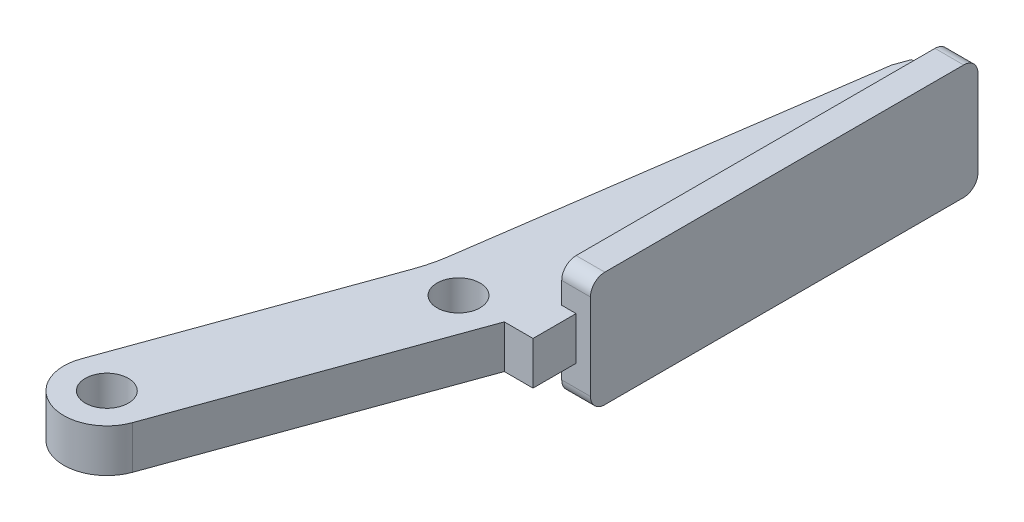
ISO-10303-21;
HEADER;
FILE_DESCRIPTION(('STEP AP214'),'2;1');
FILE_NAME('part.step','',(''),(''),'','','');
FILE_SCHEMA(('AUTOMOTIVE_DESIGN { 1 0 10303 214 1 1 1 1 }'));
ENDSEC;
DATA;
#1=APPLICATION_CONTEXT('core data for automotive mechanical design processes');
#2=APPLICATION_PROTOCOL_DEFINITION('international standard','automotive_design',2000,#1);
#3=PRODUCT_CONTEXT('',#1,'mechanical');
#4=PRODUCT('Part','Part','',(#3));
#5=PRODUCT_RELATED_PRODUCT_CATEGORY('part','',(#4));
#6=PRODUCT_DEFINITION_FORMATION('','',#4);
#7=PRODUCT_DEFINITION_CONTEXT('part definition',#1,'design');
#8=PRODUCT_DEFINITION('design','',#6,#7);
#9=PRODUCT_DEFINITION_SHAPE('','',#8);
#10=(LENGTH_UNIT() NAMED_UNIT(*) SI_UNIT(.MILLI.,.METRE.));
#11=(NAMED_UNIT(*) PLANE_ANGLE_UNIT() SI_UNIT($,.RADIAN.));
#12=(NAMED_UNIT(*) SI_UNIT($,.STERADIAN.) SOLID_ANGLE_UNIT());
#13=UNCERTAINTY_MEASURE_WITH_UNIT(LENGTH_MEASURE(1.E-05),#10,'distance_accuracy_value','');
#14=(GEOMETRIC_REPRESENTATION_CONTEXT(3) GLOBAL_UNCERTAINTY_ASSIGNED_CONTEXT((#13)) GLOBAL_UNIT_ASSIGNED_CONTEXT((#10,
#11,#12)) REPRESENTATION_CONTEXT('',''));
#15=CARTESIAN_POINT('',(0.,0.,0.));
#16=DIRECTION('',(0.,0.,1.));
#17=DIRECTION('',(1.,0.,0.));
#18=AXIS2_PLACEMENT_3D('',#15,#16,#17);
#19=CARTESIAN_POINT('',(11.6896098681674,1.5,0.));
#20=DIRECTION('',(1.,0.,0.));
#21=DIRECTION('',(0.,0.,-1.));
#22=AXIS2_PLACEMENT_3D('',#19,#20,#21);
#23=PLANE('',#22);
#24=DIRECTION('',(0.,0.,1.));
#25=VECTOR('',#24,1.);
#26=CARTESIAN_POINT('',(11.6896098681674,-1.5,0.));
#27=LINE('',#26,#25);
#28=CARTESIAN_POINT('',(11.6896098681674,-1.5,-21.));
#29=VERTEX_POINT('',#28);
#30=CARTESIAN_POINT('',(11.6896098681674,-1.5,-18.));
#31=VERTEX_POINT('',#30);
#32=EDGE_CURVE('E301',#29,#31,#27,.T.);
#33=ORIENTED_EDGE('',*,*,#32,.F.);
#34=DIRECTION('',(0.,1.,0.));
#35=VECTOR('',#34,1.);
#36=CARTESIAN_POINT('',(11.6896098681674,1.5,-21.));
#37=LINE('',#36,#35);
#38=CARTESIAN_POINT('',(11.6896098681674,1.5,-21.));
#39=VERTEX_POINT('',#38);
#40=EDGE_CURVE('E192',#29,#39,#37,.T.);
#41=ORIENTED_EDGE('',*,*,#40,.T.);
#42=DIRECTION('',(0.,0.,1.));
#43=VECTOR('',#42,1.);
#44=CARTESIAN_POINT('',(11.6896098681674,1.5,0.));
#45=LINE('',#44,#43);
#46=CARTESIAN_POINT('',(11.6896098681674,1.5,-18.));
#47=VERTEX_POINT('',#46);
#48=EDGE_CURVE('E258',#39,#47,#45,.T.);
#49=ORIENTED_EDGE('',*,*,#48,.T.);
#50=DIRECTION('',(0.,-1.,0.));
#51=VECTOR('',#50,1.);
#52=CARTESIAN_POINT('',(11.6896098681674,1.5,-18.));
#53=LINE('',#52,#51);
#54=EDGE_CURVE('E320',#47,#31,#53,.T.);
#55=ORIENTED_EDGE('',*,*,#54,.T.);
#56=EDGE_LOOP('',(#33,#41,#49,#55));
#57=FACE_BOUND('',#56,.T.);
#58=ADVANCED_FACE('F39',(#57),#23,.T.);
#59=CARTESIAN_POINT('',(0.,1.5,0.));
#60=DIRECTION('',(0.,1.,0.));
#61=DIRECTION('',(0.,0.,1.));
#62=AXIS2_PLACEMENT_3D('',#59,#60,#61);
#63=PLANE('',#62);
#64=CARTESIAN_POINT('',(6.5,1.5,-18.));
#65=DIRECTION('',(0.,1.,0.));
#66=DIRECTION('',(0.,0.,1.));
#67=AXIS2_PLACEMENT_3D('',#64,#65,#66);
#68=CIRCLE('',#67,1.5);
#69=CARTESIAN_POINT('',(6.5,1.5,-16.5));
#70=VERTEX_POINT('',#69);
#71=EDGE_CURVE('E230',#70,#70,#68,.T.);
#72=ORIENTED_EDGE('',*,*,#71,.F.);
#73=EDGE_LOOP('',(#72));
#74=FACE_BOUND('',#73,.T.);
#75=CARTESIAN_POINT('',(0.,1.5,0.));
#76=DIRECTION('',(0.,1.,0.));
#77=DIRECTION('',(0.,0.,1.));
#78=AXIS2_PLACEMENT_3D('',#75,#76,#77);
#79=CIRCLE('',#78,1.5);
#80=CARTESIAN_POINT('',(0.,1.5,1.5));
#81=VERTEX_POINT('',#80);
#82=EDGE_CURVE('E234',#81,#81,#79,.T.);
#83=ORIENTED_EDGE('',*,*,#82,.F.);
#84=EDGE_LOOP('',(#83));
#85=FACE_BOUND('',#84,.T.);
#86=DIRECTION('',(-1.,0.,0.));
#87=VECTOR('',#86,1.);
#88=CARTESIAN_POINT('',(0.,1.5,-21.));
#89=LINE('',#88,#87);
#90=CARTESIAN_POINT('',(10.6896098681674,1.5,-21.));
#91=VERTEX_POINT('',#90);
#92=EDGE_CURVE('E221',#39,#91,#89,.T.);
#93=ORIENTED_EDGE('',*,*,#92,.T.);
#94=DIRECTION('',(0.,0.,-1.));
#95=VECTOR('',#94,1.);
#96=CARTESIAN_POINT('',(10.6896098681674,1.5,0.));
#97=LINE('',#96,#95);
#98=CARTESIAN_POINT('',(10.6896098681674,1.5,-48.));
#99=VERTEX_POINT('',#98);
#100=EDGE_CURVE('E225',#91,#99,#97,.T.);
#101=ORIENTED_EDGE('',*,*,#100,.T.);
#102=DIRECTION('',(1.,0.,0.));
#103=VECTOR('',#102,1.);
#104=CARTESIAN_POINT('',(0.,1.5,-48.));
#105=LINE('',#104,#103);
#106=CARTESIAN_POINT('',(8.05072097927854,1.5,-48.));
#107=VERTEX_POINT('',#106);
#108=EDGE_CURVE('E261',#107,#99,#105,.T.);
#109=ORIENTED_EDGE('',*,*,#108,.F.);
#110=DIRECTION('',(0.339644463777556,0.,-0.940553899691696));
#111=VECTOR('',#110,1.);
#112=CARTESIAN_POINT('',(-8.211785399901,1.5,-2.96536694996424));
#113=LINE('',#112,#111);
#114=CARTESIAN_POINT('',(7.68960986816744,1.5,-47.));
#115=VERTEX_POINT('',#114);
#116=EDGE_CURVE('E265',#115,#107,#113,.T.);
#117=ORIENTED_EDGE('',*,*,#116,.F.);
#118=DIRECTION('',(0.142339631017767,0.,-0.989817876905507));
#119=VECTOR('',#118,1.);
#120=CARTESIAN_POINT('',(0.911969350312434,1.5,0.131144712428119));
#121=LINE('',#120,#119);
#122=CARTESIAN_POINT('',(3.80302990397067,1.5,-19.9730483275979));
#123=VERTEX_POINT('',#122);
#124=EDGE_CURVE('E269',#123,#115,#121,.T.);
#125=ORIENTED_EDGE('',*,*,#124,.F.);
#126=CARTESIAN_POINT('',(-6.09514886508441,1.5,-21.3964446377756));
#127=DIRECTION('',(0.,1.,0.));
#128=DIRECTION('',(0.,0.,1.));
#129=AXIS2_PLACEMENT_3D('',#126,#127,#128);
#130=CIRCLE('',#129,10.);
#131=CARTESIAN_POINT('',(3.31039013183255,1.5,-18.));
#132=VERTEX_POINT('',#131);
#133=EDGE_CURVE('E239',#132,#123,#130,.T.);
#134=ORIENTED_EDGE('',*,*,#133,.F.);
#135=DIRECTION('',(0.339644463777556,0.,-0.940553899691696));
#136=VECTOR('',#135,1.);
#137=CARTESIAN_POINT('',(-2.82166169907509,1.5,-1.01893339133267));
#138=LINE('',#137,#136);
#139=CARTESIAN_POINT('',(-2.82166169907509,1.5,-1.01893339133267));
#140=VERTEX_POINT('',#139);
#141=EDGE_CURVE('E243',#140,#132,#138,.T.);
#142=ORIENTED_EDGE('',*,*,#141,.F.);
#143=CARTESIAN_POINT('',(0.,1.5,0.));
#144=DIRECTION('',(0.,1.,0.));
#145=DIRECTION('',(0.,0.,1.));
#146=AXIS2_PLACEMENT_3D('',#143,#144,#145);
#147=CIRCLE('',#146,3.);
#148=CARTESIAN_POINT('',(2.82166169907509,1.5,1.01893339133267));
#149=VERTEX_POINT('',#148);
#150=EDGE_CURVE('E247',#140,#149,#147,.T.);
#151=ORIENTED_EDGE('',*,*,#150,.T.);
#152=DIRECTION('',(-0.339644463777557,0.,0.940553899691696));
#153=VECTOR('',#152,1.);
#154=CARTESIAN_POINT('',(2.82166169907509,1.5,1.01893339133267));
#155=LINE('',#154,#153);
#156=CARTESIAN_POINT('',(9.68960986816744,1.5,-18.));
#157=VERTEX_POINT('',#156);
#158=EDGE_CURVE('E250',#157,#149,#155,.T.);
#159=ORIENTED_EDGE('',*,*,#158,.F.);
#160=DIRECTION('',(-1.,0.,0.));
#161=VECTOR('',#160,1.);
#162=CARTESIAN_POINT('',(0.,1.5,-18.));
#163=LINE('',#162,#161);
#164=EDGE_CURVE('E254',#47,#157,#163,.T.);
#165=ORIENTED_EDGE('',*,*,#164,.F.);
#166=ORIENTED_EDGE('',*,*,#48,.F.);
#167=EDGE_LOOP('',(#93,#101,#109,#117,#125,#134,#142,#151,#159,#165,#166));
#168=FACE_BOUND('',#167,.T.);
#169=ADVANCED_FACE('F420',(#74,#85,#168),#63,.T.);
#170=CARTESIAN_POINT('',(0.,-1.5,0.));
#171=DIRECTION('',(0.,1.,0.));
#172=DIRECTION('',(0.,0.,1.));
#173=AXIS2_PLACEMENT_3D('',#170,#171,#172);
#174=PLANE('',#173);
#175=CARTESIAN_POINT('',(0.,-1.5,0.));
#176=DIRECTION('',(0.,1.,0.));
#177=DIRECTION('',(0.,0.,1.));
#178=AXIS2_PLACEMENT_3D('',#175,#176,#177);
#179=CIRCLE('',#178,1.5);
#180=CARTESIAN_POINT('',(0.,-1.5,1.5));
#181=VERTEX_POINT('',#180);
#182=EDGE_CURVE('E277',#181,#181,#179,.T.);
#183=ORIENTED_EDGE('',*,*,#182,.T.);
#184=EDGE_LOOP('',(#183));
#185=FACE_BOUND('',#184,.T.);
#186=CARTESIAN_POINT('',(6.5,-1.5,-18.));
#187=DIRECTION('',(0.,1.,0.));
#188=DIRECTION('',(0.,0.,1.));
#189=AXIS2_PLACEMENT_3D('',#186,#187,#188);
#190=CIRCLE('',#189,1.5);
#191=CARTESIAN_POINT('',(6.5,-1.5,-16.5));
#192=VERTEX_POINT('',#191);
#193=EDGE_CURVE('E229',#192,#192,#190,.T.);
#194=ORIENTED_EDGE('',*,*,#193,.T.);
#195=EDGE_LOOP('',(#194));
#196=FACE_BOUND('',#195,.T.);
#197=DIRECTION('',(0.,0.,-1.));
#198=VECTOR('',#197,1.);
#199=CARTESIAN_POINT('',(10.6896098681674,-1.5,0.));
#200=LINE('',#199,#198);
#201=CARTESIAN_POINT('',(10.6896098681674,-1.5,-21.));
#202=VERTEX_POINT('',#201);
#203=CARTESIAN_POINT('',(10.6896098681674,-1.5,-48.));
#204=VERTEX_POINT('',#203);
#205=EDGE_CURVE('E171',#202,#204,#200,.T.);
#206=ORIENTED_EDGE('',*,*,#205,.F.);
#207=DIRECTION('',(-1.,0.,0.));
#208=VECTOR('',#207,1.);
#209=CARTESIAN_POINT('',(0.,-1.5,-21.));
#210=LINE('',#209,#208);
#211=EDGE_CURVE('E174',#29,#202,#210,.T.);
#212=ORIENTED_EDGE('',*,*,#211,.F.);
#213=ORIENTED_EDGE('',*,*,#32,.T.);
#214=DIRECTION('',(-1.,0.,0.));
#215=VECTOR('',#214,1.);
#216=CARTESIAN_POINT('',(0.,-1.5,-18.));
#217=LINE('',#216,#215);
#218=CARTESIAN_POINT('',(9.68960986816744,-1.5,-18.));
#219=VERTEX_POINT('',#218);
#220=EDGE_CURVE('E297',#31,#219,#217,.T.);
#221=ORIENTED_EDGE('',*,*,#220,.T.);
#222=DIRECTION('',(-0.339644463777557,0.,0.940553899691696));
#223=VECTOR('',#222,1.);
#224=CARTESIAN_POINT('',(2.82166169907509,-1.5,1.01893339133267));
#225=LINE('',#224,#223);
#226=CARTESIAN_POINT('',(2.82166169907509,-1.5,1.01893339133267));
#227=VERTEX_POINT('',#226);
#228=EDGE_CURVE('E293',#219,#227,#225,.T.);
#229=ORIENTED_EDGE('',*,*,#228,.T.);
#230=CARTESIAN_POINT('',(0.,-1.5,0.));
#231=DIRECTION('',(0.,1.,0.));
#232=DIRECTION('',(0.,0.,1.));
#233=AXIS2_PLACEMENT_3D('',#230,#231,#232);
#234=CIRCLE('',#233,3.);
#235=CARTESIAN_POINT('',(-2.82166169907509,-1.5,-1.01893339133267));
#236=VERTEX_POINT('',#235);
#237=EDGE_CURVE('E289',#236,#227,#234,.T.);
#238=ORIENTED_EDGE('',*,*,#237,.F.);
#239=DIRECTION('',(0.339644463777556,0.,-0.940553899691696));
#240=VECTOR('',#239,1.);
#241=CARTESIAN_POINT('',(-2.82166169907509,-1.5,-1.01893339133267));
#242=LINE('',#241,#240);
#243=CARTESIAN_POINT('',(3.31039013183255,-1.5,-18.));
#244=VERTEX_POINT('',#243);
#245=EDGE_CURVE('E285',#236,#244,#242,.T.);
#246=ORIENTED_EDGE('',*,*,#245,.T.);
#247=CARTESIAN_POINT('',(-6.09514886508441,-1.5,-21.3964446377756));
#248=DIRECTION('',(0.,1.,0.));
#249=DIRECTION('',(0.,0.,1.));
#250=AXIS2_PLACEMENT_3D('',#247,#248,#249);
#251=CIRCLE('',#250,10.);
#252=CARTESIAN_POINT('',(3.80302990397067,-1.5,-19.9730483275979));
#253=VERTEX_POINT('',#252);
#254=EDGE_CURVE('E281',#244,#253,#251,.T.);
#255=ORIENTED_EDGE('',*,*,#254,.T.);
#256=DIRECTION('',(0.142339631017767,0.,-0.989817876905507));
#257=VECTOR('',#256,1.);
#258=CARTESIAN_POINT('',(0.911969350312434,-1.5,0.131144712428119));
#259=LINE('',#258,#257);
#260=CARTESIAN_POINT('',(7.68960986816744,-1.5,-47.));
#261=VERTEX_POINT('',#260);
#262=EDGE_CURVE('E235',#253,#261,#259,.T.);
#263=ORIENTED_EDGE('',*,*,#262,.T.);
#264=DIRECTION('',(0.339644463777556,0.,-0.940553899691696));
#265=VECTOR('',#264,1.);
#266=CARTESIAN_POINT('',(-8.211785399901,-1.5,-2.96536694996424));
#267=LINE('',#266,#265);
#268=CARTESIAN_POINT('',(8.05072097927854,-1.5,-48.));
#269=VERTEX_POINT('',#268);
#270=EDGE_CURVE('E306',#261,#269,#267,.T.);
#271=ORIENTED_EDGE('',*,*,#270,.T.);
#272=DIRECTION('',(1.,0.,0.));
#273=VECTOR('',#272,1.);
#274=CARTESIAN_POINT('',(0.,-1.5,-48.));
#275=LINE('',#274,#273);
#276=EDGE_CURVE('E178',#269,#204,#275,.T.);
#277=ORIENTED_EDGE('',*,*,#276,.T.);
#278=EDGE_LOOP('',(#206,#212,#213,#221,#229,#238,#246,#255,#263,#271,#277));
#279=FACE_BOUND('',#278,.T.);
#280=ADVANCED_FACE('F173',(#185,#196,#279),#174,.F.);
#281=CARTESIAN_POINT('',(-6.09514886508441,1.5,-21.3964446377756));
#282=DIRECTION('',(0.,-1.,0.));
#283=DIRECTION('',(0.,0.,-1.));
#284=AXIS2_PLACEMENT_3D('',#281,#282,#283);
#285=CYLINDRICAL_SURFACE('',#284,10.);
#286=ORIENTED_EDGE('',*,*,#254,.F.);
#287=DIRECTION('',(0.,-1.,0.));
#288=VECTOR('',#287,1.);
#289=CARTESIAN_POINT('',(3.31039013183255,1.5,-18.));
#290=LINE('',#289,#288);
#291=EDGE_CURVE('E194',#132,#244,#290,.T.);
#292=ORIENTED_EDGE('',*,*,#291,.F.);
#293=ORIENTED_EDGE('',*,*,#133,.T.);
#294=DIRECTION('',(0.,-1.,0.));
#295=VECTOR('',#294,1.);
#296=CARTESIAN_POINT('',(3.80302990397067,1.5,-19.9730483275979));
#297=LINE('',#296,#295);
#298=EDGE_CURVE('E273',#123,#253,#297,.T.);
#299=ORIENTED_EDGE('',*,*,#298,.T.);
#300=EDGE_LOOP('',(#286,#292,#293,#299));
#301=FACE_BOUND('',#300,.T.);
#302=ADVANCED_FACE('F478',(#301),#285,.F.);
#303=CARTESIAN_POINT('',(-2.82166169907509,1.5,-1.01893339133267));
#304=DIRECTION('',(-0.940553899691695,0.,-0.339644463777556));
#305=DIRECTION('',(-0.339644463777556,0.,0.940553899691696));
#306=AXIS2_PLACEMENT_3D('',#303,#304,#305);
#307=PLANE('',#306);
#308=ORIENTED_EDGE('',*,*,#245,.F.);
#309=DIRECTION('',(0.,-1.,0.));
#310=VECTOR('',#309,1.);
#311=CARTESIAN_POINT('',(-2.82166169907509,1.5,-1.01893339133267));
#312=LINE('',#311,#310);
#313=EDGE_CURVE('E330',#140,#236,#312,.T.);
#314=ORIENTED_EDGE('',*,*,#313,.F.);
#315=ORIENTED_EDGE('',*,*,#141,.T.);
#316=ORIENTED_EDGE('',*,*,#291,.T.);
#317=EDGE_LOOP('',(#308,#314,#315,#316));
#318=FACE_BOUND('',#317,.T.);
#319=ADVANCED_FACE('F433',(#318),#307,.T.);
#320=CARTESIAN_POINT('',(0.,1.5,0.));
#321=DIRECTION('',(0.,-1.,0.));
#322=DIRECTION('',(0.,0.,-1.));
#323=AXIS2_PLACEMENT_3D('',#320,#321,#322);
#324=CYLINDRICAL_SURFACE('',#323,3.);
#325=ORIENTED_EDGE('',*,*,#237,.T.);
#326=DIRECTION('',(0.,-1.,0.));
#327=VECTOR('',#326,1.);
#328=CARTESIAN_POINT('',(2.82166169907509,1.5,1.01893339133267));
#329=LINE('',#328,#327);
#330=EDGE_CURVE('E327',#149,#227,#329,.T.);
#331=ORIENTED_EDGE('',*,*,#330,.F.);
#332=ORIENTED_EDGE('',*,*,#150,.F.);
#333=ORIENTED_EDGE('',*,*,#313,.T.);
#334=EDGE_LOOP('',(#325,#331,#332,#333));
#335=FACE_BOUND('',#334,.T.);
#336=ADVANCED_FACE('F439',(#335),#324,.T.);
#337=CARTESIAN_POINT('',(2.82166169907509,1.5,1.01893339133267));
#338=DIRECTION('',(0.940553899691695,0.,0.339644463777557));
#339=DIRECTION('',(0.339644463777557,0.,-0.940553899691696));
#340=AXIS2_PLACEMENT_3D('',#337,#338,#339);
#341=PLANE('',#340);
#342=ORIENTED_EDGE('',*,*,#228,.F.);
#343=DIRECTION('',(0.,-1.,0.));
#344=VECTOR('',#343,1.);
#345=CARTESIAN_POINT('',(9.68960986816744,1.5,-18.));
#346=LINE('',#345,#344);
#347=EDGE_CURVE('E324',#157,#219,#346,.T.);
#348=ORIENTED_EDGE('',*,*,#347,.F.);
#349=ORIENTED_EDGE('',*,*,#158,.T.);
#350=ORIENTED_EDGE('',*,*,#330,.T.);
#351=EDGE_LOOP('',(#342,#348,#349,#350));
#352=FACE_BOUND('',#351,.T.);
#353=ADVANCED_FACE('F471',(#352),#341,.T.);
#354=CARTESIAN_POINT('',(0.,1.5,-18.));
#355=DIRECTION('',(0.,0.,1.));
#356=DIRECTION('',(1.,0.,0.));
#357=AXIS2_PLACEMENT_3D('',#354,#355,#356);
#358=PLANE('',#357);
#359=ORIENTED_EDGE('',*,*,#220,.F.);
#360=ORIENTED_EDGE('',*,*,#54,.F.);
#361=ORIENTED_EDGE('',*,*,#164,.T.);
#362=ORIENTED_EDGE('',*,*,#347,.T.);
#363=EDGE_LOOP('',(#359,#360,#361,#362));
#364=FACE_BOUND('',#363,.T.);
#365=ADVANCED_FACE('F447',(#364),#358,.T.);
#366=CARTESIAN_POINT('',(0.,1.5,-48.));
#367=DIRECTION('',(0.,0.,-1.));
#368=DIRECTION('',(-1.,0.,0.));
#369=AXIS2_PLACEMENT_3D('',#366,#367,#368);
#370=PLANE('',#369);
#371=DIRECTION('',(0.,-1.,0.));
#372=VECTOR('',#371,1.);
#373=CARTESIAN_POINT('',(12.6896098681674,4.,-48.));
#374=LINE('',#373,#372);
#375=CARTESIAN_POINT('',(12.6896098681674,3.,-48.));
#376=VERTEX_POINT('',#375);
#377=CARTESIAN_POINT('',(12.6896098681674,-3.,-48.));
#378=VERTEX_POINT('',#377);
#379=EDGE_CURVE('E215',#376,#378,#374,.T.);
#380=ORIENTED_EDGE('',*,*,#379,.T.);
#381=DIRECTION('',(-1.,0.,0.));
#382=VECTOR('',#381,1.);
#383=CARTESIAN_POINT('',(0.,-3.,-48.));
#384=LINE('',#383,#382);
#385=CARTESIAN_POINT('',(10.6896098681674,-3.,-48.));
#386=VERTEX_POINT('',#385);
#387=EDGE_CURVE('E337',#378,#386,#384,.T.);
#388=ORIENTED_EDGE('',*,*,#387,.T.);
#389=DIRECTION('',(0.,-1.,0.));
#390=VECTOR('',#389,1.);
#391=CARTESIAN_POINT('',(10.6896098681674,4.,-48.));
#392=LINE('',#391,#390);
#393=EDGE_CURVE('E206',#204,#386,#392,.T.);
#394=ORIENTED_EDGE('',*,*,#393,.F.);
#395=ORIENTED_EDGE('',*,*,#276,.F.);
#396=DIRECTION('',(0.,-1.,0.));
#397=VECTOR('',#396,1.);
#398=CARTESIAN_POINT('',(8.05072097927854,1.5,-48.));
#399=LINE('',#398,#397);
#400=EDGE_CURVE('E317',#107,#269,#399,.T.);
#401=ORIENTED_EDGE('',*,*,#400,.F.);
#402=ORIENTED_EDGE('',*,*,#108,.T.);
#403=CARTESIAN_POINT('',(10.6896098681674,3.,-48.));
#404=VERTEX_POINT('',#403);
#405=EDGE_CURVE('E212',#404,#99,#392,.T.);
#406=ORIENTED_EDGE('',*,*,#405,.F.);
#407=DIRECTION('',(-1.,0.,0.));
#408=VECTOR('',#407,1.);
#409=CARTESIAN_POINT('',(12.6896098681674,3.,-48.));
#410=LINE('',#409,#408);
#411=EDGE_CURVE('E184',#404,#376,#410,.F.);
#412=ORIENTED_EDGE('',*,*,#411,.T.);
#413=EDGE_LOOP('',(#380,#388,#394,#395,#401,#402,#406,#412));
#414=FACE_BOUND('',#413,.T.);
#415=ADVANCED_FACE('F380',(#414),#370,.T.);
#416=CARTESIAN_POINT('',(-8.211785399901,1.5,-2.96536694996424));
#417=DIRECTION('',(-0.940553899691696,0.,-0.339644463777556));
#418=DIRECTION('',(-0.339644463777556,0.,0.940553899691696));
#419=AXIS2_PLACEMENT_3D('',#416,#417,#418);
#420=PLANE('',#419);
#421=ORIENTED_EDGE('',*,*,#270,.F.);
#422=DIRECTION('',(0.,-1.,0.));
#423=VECTOR('',#422,1.);
#424=CARTESIAN_POINT('',(7.68960986816744,1.5,-47.));
#425=LINE('',#424,#423);
#426=EDGE_CURVE('E314',#115,#261,#425,.T.);
#427=ORIENTED_EDGE('',*,*,#426,.F.);
#428=ORIENTED_EDGE('',*,*,#116,.T.);
#429=ORIENTED_EDGE('',*,*,#400,.T.);
#430=EDGE_LOOP('',(#421,#427,#428,#429));
#431=FACE_BOUND('',#430,.T.);
#432=ADVANCED_FACE('F424',(#431),#420,.T.);
#433=CARTESIAN_POINT('',(0.,1.5,0.));
#434=DIRECTION('',(0.,-1.,0.));
#435=DIRECTION('',(0.,0.,-1.));
#436=AXIS2_PLACEMENT_3D('',#433,#434,#435);
#437=CYLINDRICAL_SURFACE('',#436,1.5);
#438=ORIENTED_EDGE('',*,*,#82,.T.);
#439=EDGE_LOOP('',(#438));
#440=FACE_BOUND('',#439,.T.);
#441=ORIENTED_EDGE('',*,*,#182,.F.);
#442=EDGE_LOOP('',(#441));
#443=FACE_BOUND('',#442,.T.);
#444=ADVANCED_FACE('F481',(#440,#443),#437,.F.);
#445=CARTESIAN_POINT('',(6.5,1.5,-18.));
#446=DIRECTION('',(0.,-1.,0.));
#447=DIRECTION('',(0.,0.,-1.));
#448=AXIS2_PLACEMENT_3D('',#445,#446,#447);
#449=CYLINDRICAL_SURFACE('',#448,1.5);
#450=ORIENTED_EDGE('',*,*,#71,.T.);
#451=EDGE_LOOP('',(#450));
#452=FACE_BOUND('',#451,.T.);
#453=ORIENTED_EDGE('',*,*,#193,.F.);
#454=EDGE_LOOP('',(#453));
#455=FACE_BOUND('',#454,.T.);
#456=ADVANCED_FACE('F484',(#452,#455),#449,.F.);
#457=CARTESIAN_POINT('',(0.911969350312434,1.5,0.131144712428119));
#458=DIRECTION('',(-0.989817876905507,0.,-0.142339631017767));
#459=DIRECTION('',(-0.142339631017767,0.,0.989817876905507));
#460=AXIS2_PLACEMENT_3D('',#457,#458,#459);
#461=PLANE('',#460);
#462=ORIENTED_EDGE('',*,*,#262,.F.);
#463=ORIENTED_EDGE('',*,*,#298,.F.);
#464=ORIENTED_EDGE('',*,*,#124,.T.);
#465=ORIENTED_EDGE('',*,*,#426,.T.);
#466=EDGE_LOOP('',(#462,#463,#464,#465));
#467=FACE_BOUND('',#466,.T.);
#468=ADVANCED_FACE('F427',(#467),#461,.T.);
#469=CARTESIAN_POINT('',(10.6896098681674,4.,-21.));
#470=DIRECTION('',(1.,0.,0.));
#471=DIRECTION('',(0.,0.,-1.));
#472=AXIS2_PLACEMENT_3D('',#469,#470,#471);
#473=PLANE('',#472);
#474=ORIENTED_EDGE('',*,*,#393,.T.);
#475=CARTESIAN_POINT('',(10.6896098681674,-3.,-47.));
#476=DIRECTION('',(1.,0.,0.));
#477=DIRECTION('',(0.,0.,-1.));
#478=AXIS2_PLACEMENT_3D('',#475,#476,#477);
#479=CIRCLE('',#478,1.);
#480=CARTESIAN_POINT('',(10.6896098681674,-4.,-47.));
#481=VERTEX_POINT('',#480);
#482=EDGE_CURVE('E343',#386,#481,#479,.F.);
#483=ORIENTED_EDGE('',*,*,#482,.T.);
#484=DIRECTION('',(0.,0.,1.));
#485=VECTOR('',#484,1.);
#486=CARTESIAN_POINT('',(10.6896098681674,-4.,-21.));
#487=LINE('',#486,#485);
#488=CARTESIAN_POINT('',(10.6896098681674,-4.,-22.));
#489=VERTEX_POINT('',#488);
#490=EDGE_CURVE('E393',#481,#489,#487,.T.);
#491=ORIENTED_EDGE('',*,*,#490,.T.);
#492=CARTESIAN_POINT('',(10.6896098681674,-3.,-22.));
#493=DIRECTION('',(1.,0.,0.));
#494=DIRECTION('',(0.,0.,-1.));
#495=AXIS2_PLACEMENT_3D('',#492,#493,#494);
#496=CIRCLE('',#495,1.);
#497=CARTESIAN_POINT('',(10.6896098681674,-3.,-21.));
#498=VERTEX_POINT('',#497);
#499=EDGE_CURVE('E199',#489,#498,#496,.F.);
#500=ORIENTED_EDGE('',*,*,#499,.T.);
#501=DIRECTION('',(0.,-1.,0.));
#502=VECTOR('',#501,1.);
#503=CARTESIAN_POINT('',(10.6896098681674,4.,-21.));
#504=LINE('',#503,#502);
#505=EDGE_CURVE('E189',#202,#498,#504,.T.);
#506=ORIENTED_EDGE('',*,*,#505,.F.);
#507=ORIENTED_EDGE('',*,*,#205,.T.);
#508=EDGE_LOOP('',(#474,#483,#491,#500,#506,#507));
#509=FACE_BOUND('',#508,.T.);
#510=ADVANCED_FACE('F196',(#509),#473,.F.);
#511=CARTESIAN_POINT('',(12.6896098681674,4.,-21.));
#512=DIRECTION('',(-1.,0.,0.));
#513=DIRECTION('',(0.,0.,1.));
#514=AXIS2_PLACEMENT_3D('',#511,#512,#513);
#515=PLANE('',#514);
#516=DIRECTION('',(0.,0.,-1.));
#517=VECTOR('',#516,1.);
#518=CARTESIAN_POINT('',(12.6896098681674,-4.,-21.));
#519=LINE('',#518,#517);
#520=CARTESIAN_POINT('',(12.6896098681674,-4.,-22.));
#521=VERTEX_POINT('',#520);
#522=CARTESIAN_POINT('',(12.6896098681674,-4.,-47.));
#523=VERTEX_POINT('',#522);
#524=EDGE_CURVE('E391',#521,#523,#519,.T.);
#525=ORIENTED_EDGE('',*,*,#524,.T.);
#526=CARTESIAN_POINT('',(12.6896098681674,-3.,-47.));
#527=DIRECTION('',(-1.,0.,0.));
#528=DIRECTION('',(0.,0.,1.));
#529=AXIS2_PLACEMENT_3D('',#526,#527,#528);
#530=CIRCLE('',#529,1.);
#531=EDGE_CURVE('E361',#523,#378,#530,.F.);
#532=ORIENTED_EDGE('',*,*,#531,.T.);
#533=ORIENTED_EDGE('',*,*,#379,.F.);
#534=CARTESIAN_POINT('',(12.6896098681674,3.,-47.));
#535=DIRECTION('',(-1.,0.,0.));
#536=DIRECTION('',(0.,0.,1.));
#537=AXIS2_PLACEMENT_3D('',#534,#535,#536);
#538=CIRCLE('',#537,1.);
#539=CARTESIAN_POINT('',(12.6896098681674,4.,-47.));
#540=VERTEX_POINT('',#539);
#541=EDGE_CURVE('E358',#376,#540,#538,.F.);
#542=ORIENTED_EDGE('',*,*,#541,.T.);
#543=DIRECTION('',(0.,0.,-1.));
#544=VECTOR('',#543,1.);
#545=CARTESIAN_POINT('',(12.6896098681674,4.,-21.));
#546=LINE('',#545,#544);
#547=CARTESIAN_POINT('',(12.6896098681674,4.,-22.));
#548=VERTEX_POINT('',#547);
#549=EDGE_CURVE('E399',#548,#540,#546,.T.);
#550=ORIENTED_EDGE('',*,*,#549,.F.);
#551=CARTESIAN_POINT('',(12.6896098681674,3.,-22.));
#552=DIRECTION('',(-1.,0.,0.));
#553=DIRECTION('',(0.,0.,1.));
#554=AXIS2_PLACEMENT_3D('',#551,#552,#553);
#555=CIRCLE('',#554,1.);
#556=CARTESIAN_POINT('',(12.6896098681674,3.,-21.));
#557=VERTEX_POINT('',#556);
#558=EDGE_CURVE('E352',#548,#557,#555,.F.);
#559=ORIENTED_EDGE('',*,*,#558,.T.);
#560=DIRECTION('',(0.,-1.,0.));
#561=VECTOR('',#560,1.);
#562=CARTESIAN_POINT('',(12.6896098681674,4.,-21.));
#563=LINE('',#562,#561);
#564=CARTESIAN_POINT('',(12.6896098681674,-3.,-21.));
#565=VERTEX_POINT('',#564);
#566=EDGE_CURVE('E202',#557,#565,#563,.T.);
#567=ORIENTED_EDGE('',*,*,#566,.T.);
#568=CARTESIAN_POINT('',(12.6896098681674,-3.,-22.));
#569=DIRECTION('',(-1.,0.,0.));
#570=DIRECTION('',(0.,0.,1.));
#571=AXIS2_PLACEMENT_3D('',#568,#569,#570);
#572=CIRCLE('',#571,1.);
#573=EDGE_CURVE('E355',#565,#521,#572,.F.);
#574=ORIENTED_EDGE('',*,*,#573,.T.);
#575=EDGE_LOOP('',(#525,#532,#533,#542,#550,#559,#567,#574));
#576=FACE_BOUND('',#575,.T.);
#577=ADVANCED_FACE('F395',(#576),#515,.F.);
#578=DIRECTION('',(0.,0.,1.));
#579=VECTOR('',#578,1.);
#580=CARTESIAN_POINT('',(10.6896098681674,4.,-21.));
#581=LINE('',#580,#579);
#582=CARTESIAN_POINT('',(10.6896098681674,4.,-47.));
#583=VERTEX_POINT('',#582);
#584=CARTESIAN_POINT('',(10.6896098681674,4.,-22.));
#585=VERTEX_POINT('',#584);
#586=EDGE_CURVE('E208',#583,#585,#581,.T.);
#587=ORIENTED_EDGE('',*,*,#586,.F.);
#588=CARTESIAN_POINT('',(10.6896098681674,3.,-47.));
#589=DIRECTION('',(1.,0.,0.));
#590=DIRECTION('',(0.,0.,-1.));
#591=AXIS2_PLACEMENT_3D('',#588,#589,#590);
#592=CIRCLE('',#591,1.);
#593=EDGE_CURVE('E374',#583,#404,#592,.F.);
#594=ORIENTED_EDGE('',*,*,#593,.T.);
#595=ORIENTED_EDGE('',*,*,#405,.T.);
#596=ORIENTED_EDGE('',*,*,#100,.F.);
#597=CARTESIAN_POINT('',(10.6896098681674,3.,-21.));
#598=VERTEX_POINT('',#597);
#599=EDGE_CURVE('E201',#598,#91,#504,.T.);
#600=ORIENTED_EDGE('',*,*,#599,.F.);
#601=CARTESIAN_POINT('',(10.6896098681674,3.,-22.));
#602=DIRECTION('',(1.,0.,0.));
#603=DIRECTION('',(0.,0.,-1.));
#604=AXIS2_PLACEMENT_3D('',#601,#602,#603);
#605=CIRCLE('',#604,1.);
#606=EDGE_CURVE('E61',#598,#585,#605,.F.);
#607=ORIENTED_EDGE('',*,*,#606,.T.);
#608=EDGE_LOOP('',(#587,#594,#595,#596,#600,#607));
#609=FACE_BOUND('',#608,.T.);
#610=ADVANCED_FACE('F415',(#609),#473,.F.);
#611=CARTESIAN_POINT('',(10.6896098681674,4.,-21.));
#612=DIRECTION('',(0.,0.,-1.));
#613=DIRECTION('',(-1.,0.,0.));
#614=AXIS2_PLACEMENT_3D('',#611,#612,#613);
#615=PLANE('',#614);
#616=ORIENTED_EDGE('',*,*,#505,.T.);
#617=DIRECTION('',(1.,0.,0.));
#618=VECTOR('',#617,1.);
#619=CARTESIAN_POINT('',(12.6896098681674,-3.,-21.));
#620=LINE('',#619,#618);
#621=EDGE_CURVE('E11',#498,#565,#620,.T.);
#622=ORIENTED_EDGE('',*,*,#621,.T.);
#623=ORIENTED_EDGE('',*,*,#566,.F.);
#624=DIRECTION('',(1.,0.,0.));
#625=VECTOR('',#624,1.);
#626=CARTESIAN_POINT('',(10.6896098681674,3.,-21.));
#627=LINE('',#626,#625);
#628=EDGE_CURVE('E48',#557,#598,#627,.F.);
#629=ORIENTED_EDGE('',*,*,#628,.T.);
#630=ORIENTED_EDGE('',*,*,#599,.T.);
#631=ORIENTED_EDGE('',*,*,#92,.F.);
#632=ORIENTED_EDGE('',*,*,#40,.F.);
#633=ORIENTED_EDGE('',*,*,#211,.T.);
#634=EDGE_LOOP('',(#616,#622,#623,#629,#630,#631,#632,#633));
#635=FACE_BOUND('',#634,.T.);
#636=ADVANCED_FACE('F188',(#635),#615,.F.);
#637=CARTESIAN_POINT('',(0.,4.,0.));
#638=DIRECTION('',(0.,-1.,0.));
#639=DIRECTION('',(0.,0.,-1.));
#640=AXIS2_PLACEMENT_3D('',#637,#638,#639);
#641=PLANE('',#640);
#642=ORIENTED_EDGE('',*,*,#549,.T.);
#643=DIRECTION('',(-1.,0.,0.));
#644=VECTOR('',#643,1.);
#645=CARTESIAN_POINT('',(10.6896098681674,4.,-47.));
#646=LINE('',#645,#644);
#647=EDGE_CURVE('E368',#540,#583,#646,.T.);
#648=ORIENTED_EDGE('',*,*,#647,.T.);
#649=ORIENTED_EDGE('',*,*,#586,.T.);
#650=DIRECTION('',(1.,0.,0.));
#651=VECTOR('',#650,1.);
#652=CARTESIAN_POINT('',(0.,4.,-22.));
#653=LINE('',#652,#651);
#654=EDGE_CURVE('E364',#585,#548,#653,.T.);
#655=ORIENTED_EDGE('',*,*,#654,.T.);
#656=EDGE_LOOP('',(#642,#648,#649,#655));
#657=FACE_BOUND('',#656,.T.);
#658=ADVANCED_FACE('F408',(#657),#641,.F.);
#659=CARTESIAN_POINT('',(0.,-4.,0.));
#660=DIRECTION('',(0.,-1.,0.));
#661=DIRECTION('',(0.,0.,-1.));
#662=AXIS2_PLACEMENT_3D('',#659,#660,#661);
#663=PLANE('',#662);
#664=ORIENTED_EDGE('',*,*,#490,.F.);
#665=DIRECTION('',(-1.,0.,0.));
#666=VECTOR('',#665,1.);
#667=CARTESIAN_POINT('',(0.,-4.,-47.));
#668=LINE('',#667,#666);
#669=EDGE_CURVE('E349',#481,#523,#668,.F.);
#670=ORIENTED_EDGE('',*,*,#669,.T.);
#671=ORIENTED_EDGE('',*,*,#524,.F.);
#672=DIRECTION('',(1.,0.,0.));
#673=VECTOR('',#672,1.);
#674=CARTESIAN_POINT('',(10.6896098681674,-4.,-22.));
#675=LINE('',#674,#673);
#676=EDGE_CURVE('E346',#521,#489,#675,.F.);
#677=ORIENTED_EDGE('',*,*,#676,.T.);
#678=EDGE_LOOP('',(#664,#670,#671,#677));
#679=FACE_BOUND('',#678,.T.);
#680=ADVANCED_FACE('F390',(#679),#663,.T.);
#681=CARTESIAN_POINT('',(0.,-3.,-47.));
#682=DIRECTION('',(-1.,0.,0.));
#683=DIRECTION('',(0.,0.,1.));
#684=AXIS2_PLACEMENT_3D('',#681,#682,#683);
#685=CYLINDRICAL_SURFACE('',#684,1.);
#686=ORIENTED_EDGE('',*,*,#531,.F.);
#687=ORIENTED_EDGE('',*,*,#669,.F.);
#688=ORIENTED_EDGE('',*,*,#482,.F.);
#689=ORIENTED_EDGE('',*,*,#387,.F.);
#690=EDGE_LOOP('',(#686,#687,#688,#689));
#691=FACE_BOUND('',#690,.T.);
#692=ADVANCED_FACE('F385',(#691),#685,.T.);
#693=CARTESIAN_POINT('',(0.,3.,-47.));
#694=DIRECTION('',(1.,0.,0.));
#695=DIRECTION('',(0.,0.,-1.));
#696=AXIS2_PLACEMENT_3D('',#693,#694,#695);
#697=CYLINDRICAL_SURFACE('',#696,1.);
#698=ORIENTED_EDGE('',*,*,#541,.F.);
#699=ORIENTED_EDGE('',*,*,#411,.F.);
#700=ORIENTED_EDGE('',*,*,#593,.F.);
#701=ORIENTED_EDGE('',*,*,#647,.F.);
#702=EDGE_LOOP('',(#698,#699,#700,#701));
#703=FACE_BOUND('',#702,.T.);
#704=ADVANCED_FACE('F412',(#703),#697,.T.);
#705=CARTESIAN_POINT('',(10.6896098681674,-3.,-22.));
#706=DIRECTION('',(-1.,0.,0.));
#707=DIRECTION('',(0.,0.,1.));
#708=AXIS2_PLACEMENT_3D('',#705,#706,#707);
#709=CYLINDRICAL_SURFACE('',#708,1.);
#710=ORIENTED_EDGE('',*,*,#499,.F.);
#711=ORIENTED_EDGE('',*,*,#676,.F.);
#712=ORIENTED_EDGE('',*,*,#573,.F.);
#713=ORIENTED_EDGE('',*,*,#621,.F.);
#714=EDGE_LOOP('',(#710,#711,#712,#713));
#715=FACE_BOUND('',#714,.T.);
#716=ADVANCED_FACE('F452',(#715),#709,.T.);
#717=CARTESIAN_POINT('',(0.,3.,-22.));
#718=DIRECTION('',(1.,0.,0.));
#719=DIRECTION('',(0.,0.,-1.));
#720=AXIS2_PLACEMENT_3D('',#717,#718,#719);
#721=CYLINDRICAL_SURFACE('',#720,1.);
#722=ORIENTED_EDGE('',*,*,#606,.F.);
#723=ORIENTED_EDGE('',*,*,#628,.F.);
#724=ORIENTED_EDGE('',*,*,#558,.F.);
#725=ORIENTED_EDGE('',*,*,#654,.F.);
#726=EDGE_LOOP('',(#722,#723,#724,#725));
#727=FACE_BOUND('',#726,.T.);
#728=ADVANCED_FACE('F41',(#727),#721,.T.);
#729=CLOSED_SHELL('',(#58,#169,#280,#302,#319,#336,#353,#365,#415,#432,#444,#456,#468,#510,#577,
#610,#636,#658,#680,#692,#704,#716,#728));
#730=MANIFOLD_SOLID_BREP('B2',#729);
#731=ADVANCED_BREP_SHAPE_REPRESENTATION('',(#18,#730),#14);
#732=SHAPE_DEFINITION_REPRESENTATION(#9,#731);
ENDSEC;
END-ISO-10303-21;
